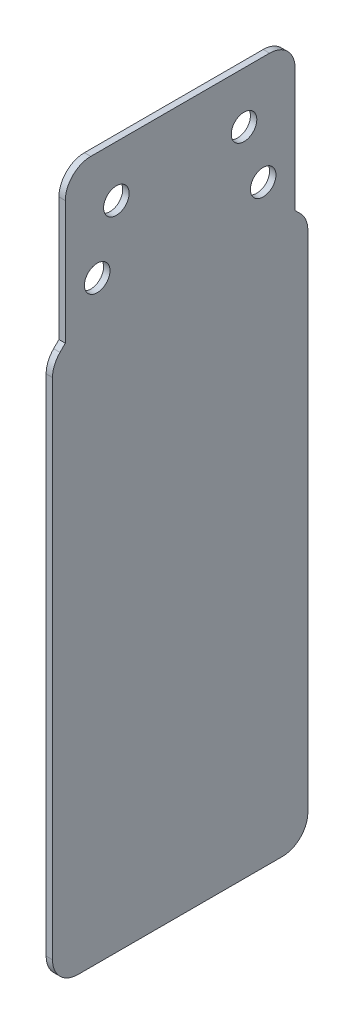
ISO-10303-21;
HEADER;
FILE_DESCRIPTION(('STEP AP214'),'2;1');
FILE_NAME('part.step','',(''),(''),'','','');
FILE_SCHEMA(('AUTOMOTIVE_DESIGN { 1 0 10303 214 1 1 1 1 }'));
ENDSEC;
DATA;
#1=APPLICATION_CONTEXT('core data for automotive mechanical design processes');
#2=APPLICATION_PROTOCOL_DEFINITION('international standard','automotive_design',2000,#1);
#3=PRODUCT_CONTEXT('',#1,'mechanical');
#4=PRODUCT('Part','Part','',(#3));
#5=PRODUCT_RELATED_PRODUCT_CATEGORY('part','',(#4));
#6=PRODUCT_DEFINITION_FORMATION('','',#4);
#7=PRODUCT_DEFINITION_CONTEXT('part definition',#1,'design');
#8=PRODUCT_DEFINITION('design','',#6,#7);
#9=PRODUCT_DEFINITION_SHAPE('','',#8);
#10=(LENGTH_UNIT() NAMED_UNIT(*) SI_UNIT(.MILLI.,.METRE.));
#11=(NAMED_UNIT(*) PLANE_ANGLE_UNIT() SI_UNIT($,.RADIAN.));
#12=(NAMED_UNIT(*) SI_UNIT($,.STERADIAN.) SOLID_ANGLE_UNIT());
#13=UNCERTAINTY_MEASURE_WITH_UNIT(LENGTH_MEASURE(1.E-05),#10,'distance_accuracy_value','');
#14=(GEOMETRIC_REPRESENTATION_CONTEXT(3) GLOBAL_UNCERTAINTY_ASSIGNED_CONTEXT((#13)) GLOBAL_UNIT_ASSIGNED_CONTEXT((#10,
#11,#12)) REPRESENTATION_CONTEXT('',''));
#15=CARTESIAN_POINT('',(0.,0.,0.));
#16=DIRECTION('',(0.,0.,1.));
#17=DIRECTION('',(1.,0.,0.));
#18=AXIS2_PLACEMENT_3D('',#15,#16,#17);
#19=CARTESIAN_POINT('',(1.,0.,-18.));
#20=DIRECTION('',(0.,0.,-1.));
#21=DIRECTION('',(0.,1.,0.));
#22=AXIS2_PLACEMENT_3D('',#19,#20,#21);
#23=PLANE('',#22);
#24=DIRECTION('',(0.,-1.,0.));
#25=VECTOR('',#24,1.);
#26=CARTESIAN_POINT('',(0.,0.,-18.));
#27=LINE('',#26,#25);
#28=CARTESIAN_POINT('',(0.,-3.99999999999999,-18.));
#29=VERTEX_POINT('',#28);
#30=CARTESIAN_POINT('',(0.,-23.35,-18.));
#31=VERTEX_POINT('',#30);
#32=EDGE_CURVE('E240',#29,#31,#27,.T.);
#33=ORIENTED_EDGE('',*,*,#32,.F.);
#34=DIRECTION('',(-1.,0.,0.));
#35=VECTOR('',#34,1.);
#36=CARTESIAN_POINT('',(1.,-3.99999999999999,-18.));
#37=LINE('',#36,#35);
#38=CARTESIAN_POINT('',(1.,-3.99999999999999,-18.));
#39=VERTEX_POINT('',#38);
#40=EDGE_CURVE('E158',#29,#39,#37,.F.);
#41=ORIENTED_EDGE('',*,*,#40,.T.);
#42=DIRECTION('',(0.,-1.,0.));
#43=VECTOR('',#42,1.);
#44=CARTESIAN_POINT('',(1.,0.,-18.));
#45=LINE('',#44,#43);
#46=CARTESIAN_POINT('',(1.00000000000003,-23.35,-18.));
#47=VERTEX_POINT('',#46);
#48=EDGE_CURVE('E144',#39,#47,#45,.T.);
#49=ORIENTED_EDGE('',*,*,#48,.T.);
#50=DIRECTION('',(-1.,0.,0.));
#51=VECTOR('',#50,1.);
#52=CARTESIAN_POINT('',(87.6730782884743,-23.35,-18.));
#53=LINE('',#52,#51);
#54=EDGE_CURVE('E152',#47,#31,#53,.T.);
#55=ORIENTED_EDGE('',*,*,#54,.T.);
#56=EDGE_LOOP('',(#33,#41,#49,#55));
#57=FACE_BOUND('',#56,.T.);
#58=ADVANCED_FACE('F39',(#57),#23,.T.);
#59=CARTESIAN_POINT('',(1.,0.,18.));
#60=DIRECTION('',(0.,0.,-1.));
#61=DIRECTION('',(0.,1.,0.));
#62=AXIS2_PLACEMENT_3D('',#59,#60,#61);
#63=PLANE('',#62);
#64=DIRECTION('',(0.,-1.,0.));
#65=VECTOR('',#64,1.);
#66=CARTESIAN_POINT('',(1.,0.,18.));
#67=LINE('',#66,#65);
#68=CARTESIAN_POINT('',(1.,-4.,18.));
#69=VERTEX_POINT('',#68);
#70=CARTESIAN_POINT('',(1.,-23.35,18.));
#71=VERTEX_POINT('',#70);
#72=EDGE_CURVE('E233',#69,#71,#67,.T.);
#73=ORIENTED_EDGE('',*,*,#72,.F.);
#74=DIRECTION('',(-1.,0.,0.));
#75=VECTOR('',#74,1.);
#76=CARTESIAN_POINT('',(0.,-4.,18.));
#77=LINE('',#76,#75);
#78=CARTESIAN_POINT('',(0.,-4.,18.));
#79=VERTEX_POINT('',#78);
#80=EDGE_CURVE('E236',#69,#79,#77,.T.);
#81=ORIENTED_EDGE('',*,*,#80,.T.);
#82=DIRECTION('',(0.,-1.,0.));
#83=VECTOR('',#82,1.);
#84=CARTESIAN_POINT('',(0.,0.,18.));
#85=LINE('',#84,#83);
#86=CARTESIAN_POINT('',(0.,-23.35,18.));
#87=VERTEX_POINT('',#86);
#88=EDGE_CURVE('E228',#79,#87,#85,.T.);
#89=ORIENTED_EDGE('',*,*,#88,.T.);
#90=DIRECTION('',(-1.,0.,0.));
#91=VECTOR('',#90,1.);
#92=CARTESIAN_POINT('',(87.6730782884743,-23.35,18.));
#93=LINE('',#92,#91);
#94=EDGE_CURVE('E180',#71,#87,#93,.T.);
#95=ORIENTED_EDGE('',*,*,#94,.F.);
#96=EDGE_LOOP('',(#73,#81,#89,#95));
#97=FACE_BOUND('',#96,.T.);
#98=ADVANCED_FACE('F351',(#97),#63,.F.);
#99=CARTESIAN_POINT('',(1.,0.,18.));
#100=DIRECTION('',(0.,1.,0.));
#101=DIRECTION('',(0.,0.,1.));
#102=AXIS2_PLACEMENT_3D('',#99,#100,#101);
#103=PLANE('',#102);
#104=DIRECTION('',(0.,0.,-1.));
#105=VECTOR('',#104,1.);
#106=CARTESIAN_POINT('',(0.,0.,18.));
#107=LINE('',#106,#105);
#108=CARTESIAN_POINT('',(0.,0.,14.));
#109=VERTEX_POINT('',#108);
#110=CARTESIAN_POINT('',(0.,0.,-14.));
#111=VERTEX_POINT('',#110);
#112=EDGE_CURVE('E225',#109,#111,#107,.T.);
#113=ORIENTED_EDGE('',*,*,#112,.F.);
#114=DIRECTION('',(-1.,0.,0.));
#115=VECTOR('',#114,1.);
#116=CARTESIAN_POINT('',(1.,0.,14.));
#117=LINE('',#116,#115);
#118=CARTESIAN_POINT('',(1.,0.,14.));
#119=VERTEX_POINT('',#118);
#120=EDGE_CURVE('E263',#109,#119,#117,.F.);
#121=ORIENTED_EDGE('',*,*,#120,.T.);
#122=DIRECTION('',(0.,0.,-1.));
#123=VECTOR('',#122,1.);
#124=CARTESIAN_POINT('',(1.,0.,18.));
#125=LINE('',#124,#123);
#126=CARTESIAN_POINT('',(1.,0.,-14.));
#127=VERTEX_POINT('',#126);
#128=EDGE_CURVE('E161',#119,#127,#125,.T.);
#129=ORIENTED_EDGE('',*,*,#128,.T.);
#130=DIRECTION('',(-1.,0.,0.));
#131=VECTOR('',#130,1.);
#132=CARTESIAN_POINT('',(1.,0.,-14.));
#133=LINE('',#132,#131);
#134=EDGE_CURVE('E259',#127,#111,#133,.T.);
#135=ORIENTED_EDGE('',*,*,#134,.T.);
#136=EDGE_LOOP('',(#113,#121,#129,#135));
#137=FACE_BOUND('',#136,.T.);
#138=ADVANCED_FACE('F343',(#137),#103,.T.);
#139=CARTESIAN_POINT('',(1.,-110.,18.));
#140=DIRECTION('',(0.,1.,0.));
#141=DIRECTION('',(0.,0.,1.));
#142=AXIS2_PLACEMENT_3D('',#139,#140,#141);
#143=PLANE('',#142);
#144=DIRECTION('',(0.,0.,-1.));
#145=VECTOR('',#144,1.);
#146=CARTESIAN_POINT('',(0.,-110.,18.));
#147=LINE('',#146,#145);
#148=CARTESIAN_POINT('',(0.,-110.,16.));
#149=VERTEX_POINT('',#148);
#150=CARTESIAN_POINT('',(0.,-110.,-16.));
#151=VERTEX_POINT('',#150);
#152=EDGE_CURVE('E243',#149,#151,#147,.T.);
#153=ORIENTED_EDGE('',*,*,#152,.T.);
#154=DIRECTION('',(-1.,0.,0.));
#155=VECTOR('',#154,1.);
#156=CARTESIAN_POINT('',(1.,-110.,-16.));
#157=LINE('',#156,#155);
#158=CARTESIAN_POINT('',(1.,-110.,-16.));
#159=VERTEX_POINT('',#158);
#160=EDGE_CURVE('E11',#151,#159,#157,.F.);
#161=ORIENTED_EDGE('',*,*,#160,.T.);
#162=DIRECTION('',(0.,0.,-1.));
#163=VECTOR('',#162,1.);
#164=CARTESIAN_POINT('',(1.,-110.,18.));
#165=LINE('',#164,#163);
#166=CARTESIAN_POINT('',(1.,-110.,16.));
#167=VERTEX_POINT('',#166);
#168=EDGE_CURVE('E160',#167,#159,#165,.T.);
#169=ORIENTED_EDGE('',*,*,#168,.F.);
#170=DIRECTION('',(-1.,0.,0.));
#171=VECTOR('',#170,1.);
#172=CARTESIAN_POINT('',(0.,-110.,16.));
#173=LINE('',#172,#171);
#174=EDGE_CURVE('E48',#167,#149,#173,.T.);
#175=ORIENTED_EDGE('',*,*,#174,.T.);
#176=EDGE_LOOP('',(#153,#161,#169,#175));
#177=FACE_BOUND('',#176,.T.);
#178=ADVANCED_FACE('F321',(#177),#143,.F.);
#179=CARTESIAN_POINT('',(1.,0.,0.));
#180=DIRECTION('',(-1.,0.,0.));
#181=DIRECTION('',(0.,0.,1.));
#182=AXIS2_PLACEMENT_3D('',#179,#180,#181);
#183=PLANE('',#182);
#184=CARTESIAN_POINT('',(1.,-17.,-13.));
#185=DIRECTION('',(-1.,0.,0.));
#186=DIRECTION('',(0.,0.,1.));
#187=AXIS2_PLACEMENT_3D('',#184,#185,#186);
#188=CIRCLE('',#187,2.);
#189=CARTESIAN_POINT('',(1.,-17.,-11.));
#190=VERTEX_POINT('',#189);
#191=EDGE_CURVE('E197',#190,#190,#188,.T.);
#192=ORIENTED_EDGE('',*,*,#191,.T.);
#193=EDGE_LOOP('',(#192));
#194=FACE_BOUND('',#193,.T.);
#195=CARTESIAN_POINT('',(1.,-17.,13.));
#196=DIRECTION('',(-1.,0.,0.));
#197=DIRECTION('',(0.,0.,1.));
#198=AXIS2_PLACEMENT_3D('',#195,#196,#197);
#199=CIRCLE('',#198,2.);
#200=CARTESIAN_POINT('',(1.,-17.,15.));
#201=VERTEX_POINT('',#200);
#202=EDGE_CURVE('E205',#201,#201,#199,.T.);
#203=ORIENTED_EDGE('',*,*,#202,.T.);
#204=EDGE_LOOP('',(#203));
#205=FACE_BOUND('',#204,.T.);
#206=CARTESIAN_POINT('',(1.,-8.,-9.99999999999999));
#207=DIRECTION('',(-1.,0.,0.));
#208=DIRECTION('',(0.,0.,1.));
#209=AXIS2_PLACEMENT_3D('',#206,#207,#208);
#210=CIRCLE('',#209,2.);
#211=CARTESIAN_POINT('',(1.,-8.,-7.99999999999999));
#212=VERTEX_POINT('',#211);
#213=EDGE_CURVE('E213',#212,#212,#210,.T.);
#214=ORIENTED_EDGE('',*,*,#213,.T.);
#215=EDGE_LOOP('',(#214));
#216=FACE_BOUND('',#215,.T.);
#217=CARTESIAN_POINT('',(1.,-8.,10.));
#218=DIRECTION('',(-1.,0.,0.));
#219=DIRECTION('',(0.,0.,1.));
#220=AXIS2_PLACEMENT_3D('',#217,#218,#219);
#221=CIRCLE('',#220,2.);
#222=CARTESIAN_POINT('',(1.,-8.,12.));
#223=VERTEX_POINT('',#222);
#224=EDGE_CURVE('E221',#223,#223,#221,.T.);
#225=ORIENTED_EDGE('',*,*,#224,.T.);
#226=EDGE_LOOP('',(#225));
#227=FACE_BOUND('',#226,.T.);
#228=DIRECTION('',(0.,-0.707106781186551,0.707106781186544));
#229=VECTOR('',#228,1.);
#230=CARTESIAN_POINT('',(1.,-23.35,18.));
#231=LINE('',#230,#229);
#232=CARTESIAN_POINT('',(1.,-24.1784271247462,18.8284271247462));
#233=VERTEX_POINT('',#232);
#234=EDGE_CURVE('E179',#71,#233,#231,.T.);
#235=ORIENTED_EDGE('',*,*,#234,.T.);
#236=CARTESIAN_POINT('',(1.,-27.0068542494924,16.));
#237=DIRECTION('',(-1.,0.,0.));
#238=DIRECTION('',(0.,0.,1.));
#239=AXIS2_PLACEMENT_3D('',#236,#237,#238);
#240=CIRCLE('',#239,4.);
#241=CARTESIAN_POINT('',(1.,-27.0068542494924,20.));
#242=VERTEX_POINT('',#241);
#243=EDGE_CURVE('E304',#233,#242,#240,.F.);
#244=ORIENTED_EDGE('',*,*,#243,.T.);
#245=DIRECTION('',(0.,-1.,0.));
#246=VECTOR('',#245,1.);
#247=CARTESIAN_POINT('',(1.,-25.35,20.));
#248=LINE('',#247,#246);
#249=CARTESIAN_POINT('',(1.,-106.,20.));
#250=VERTEX_POINT('',#249);
#251=EDGE_CURVE('E175',#242,#250,#248,.T.);
#252=ORIENTED_EDGE('',*,*,#251,.T.);
#253=CARTESIAN_POINT('',(1.,-106.,16.));
#254=DIRECTION('',(-1.,0.,0.));
#255=DIRECTION('',(0.,0.,1.));
#256=AXIS2_PLACEMENT_3D('',#253,#254,#255);
#257=CIRCLE('',#256,4.);
#258=EDGE_CURVE('E296',#250,#167,#257,.F.);
#259=ORIENTED_EDGE('',*,*,#258,.T.);
#260=ORIENTED_EDGE('',*,*,#168,.T.);
#261=CARTESIAN_POINT('',(1.,-106.,-16.));
#262=DIRECTION('',(-1.,0.,0.));
#263=DIRECTION('',(0.,0.,1.));
#264=AXIS2_PLACEMENT_3D('',#261,#262,#263);
#265=CIRCLE('',#264,4.);
#266=CARTESIAN_POINT('',(1.,-106.,-20.));
#267=VERTEX_POINT('',#266);
#268=EDGE_CURVE('E299',#159,#267,#265,.F.);
#269=ORIENTED_EDGE('',*,*,#268,.T.);
#270=DIRECTION('',(0.,1.,0.));
#271=VECTOR('',#270,1.);
#272=CARTESIAN_POINT('',(1.,-25.35,-20.));
#273=LINE('',#272,#271);
#274=CARTESIAN_POINT('',(1.,-27.0068542494924,-20.));
#275=VERTEX_POINT('',#274);
#276=EDGE_CURVE('E151',#267,#275,#273,.T.);
#277=ORIENTED_EDGE('',*,*,#276,.T.);
#278=CARTESIAN_POINT('',(1.,-27.0068542494924,-16.));
#279=DIRECTION('',(-1.,0.,0.));
#280=DIRECTION('',(0.,0.,1.));
#281=AXIS2_PLACEMENT_3D('',#278,#279,#280);
#282=CIRCLE('',#281,4.);
#283=CARTESIAN_POINT('',(1.,-24.1784271247462,-18.8284271247462));
#284=VERTEX_POINT('',#283);
#285=EDGE_CURVE('E55',#275,#284,#282,.F.);
#286=ORIENTED_EDGE('',*,*,#285,.T.);
#287=DIRECTION('',(0.,0.707106781186551,0.707106781186544));
#288=VECTOR('',#287,1.);
#289=CARTESIAN_POINT('',(1.,-23.35,-18.));
#290=LINE('',#289,#288);
#291=EDGE_CURVE('E140',#284,#47,#290,.T.);
#292=ORIENTED_EDGE('',*,*,#291,.T.);
#293=ORIENTED_EDGE('',*,*,#48,.F.);
#294=CARTESIAN_POINT('',(1.,-3.99999999999999,-14.));
#295=DIRECTION('',(-1.,0.,0.));
#296=DIRECTION('',(0.,0.,1.));
#297=AXIS2_PLACEMENT_3D('',#294,#295,#296);
#298=CIRCLE('',#297,4.);
#299=EDGE_CURVE('E266',#39,#127,#298,.F.);
#300=ORIENTED_EDGE('',*,*,#299,.T.);
#301=ORIENTED_EDGE('',*,*,#128,.F.);
#302=CARTESIAN_POINT('',(1.,-4.,14.));
#303=DIRECTION('',(-1.,0.,0.));
#304=DIRECTION('',(0.,0.,1.));
#305=AXIS2_PLACEMENT_3D('',#302,#303,#304);
#306=CIRCLE('',#305,4.);
#307=EDGE_CURVE('E269',#119,#69,#306,.F.);
#308=ORIENTED_EDGE('',*,*,#307,.T.);
#309=ORIENTED_EDGE('',*,*,#72,.T.);
#310=EDGE_LOOP('',(#235,#244,#252,#259,#260,#269,#277,#286,#292,#293,#300,#301,#308,#309));
#311=FACE_BOUND('',#310,.T.);
#312=ADVANCED_FACE('F143',(#194,#205,#216,#227,#311),#183,.F.);
#313=CARTESIAN_POINT('',(0.,0.,0.));
#314=DIRECTION('',(-1.,0.,0.));
#315=DIRECTION('',(0.,0.,1.));
#316=AXIS2_PLACEMENT_3D('',#313,#314,#315);
#317=PLANE('',#316);
#318=CARTESIAN_POINT('',(0.,-17.,-13.));
#319=DIRECTION('',(-1.,0.,0.));
#320=DIRECTION('',(0.,0.,1.));
#321=AXIS2_PLACEMENT_3D('',#318,#319,#320);
#322=CIRCLE('',#321,2.);
#323=CARTESIAN_POINT('',(0.,-17.,-11.));
#324=VERTEX_POINT('',#323);
#325=EDGE_CURVE('E183',#324,#324,#322,.T.);
#326=ORIENTED_EDGE('',*,*,#325,.F.);
#327=EDGE_LOOP('',(#326));
#328=FACE_BOUND('',#327,.T.);
#329=CARTESIAN_POINT('',(0.,-17.,13.));
#330=DIRECTION('',(-1.,0.,0.));
#331=DIRECTION('',(0.,0.,1.));
#332=AXIS2_PLACEMENT_3D('',#329,#330,#331);
#333=CIRCLE('',#332,2.);
#334=CARTESIAN_POINT('',(0.,-17.,15.));
#335=VERTEX_POINT('',#334);
#336=EDGE_CURVE('E201',#335,#335,#333,.T.);
#337=ORIENTED_EDGE('',*,*,#336,.F.);
#338=EDGE_LOOP('',(#337));
#339=FACE_BOUND('',#338,.T.);
#340=CARTESIAN_POINT('',(0.,-8.,-9.99999999999999));
#341=DIRECTION('',(-1.,0.,0.));
#342=DIRECTION('',(0.,0.,1.));
#343=AXIS2_PLACEMENT_3D('',#340,#341,#342);
#344=CIRCLE('',#343,2.);
#345=CARTESIAN_POINT('',(0.,-8.,-7.99999999999999));
#346=VERTEX_POINT('',#345);
#347=EDGE_CURVE('E209',#346,#346,#344,.T.);
#348=ORIENTED_EDGE('',*,*,#347,.F.);
#349=EDGE_LOOP('',(#348));
#350=FACE_BOUND('',#349,.T.);
#351=CARTESIAN_POINT('',(0.,-8.,10.));
#352=DIRECTION('',(-1.,0.,0.));
#353=DIRECTION('',(0.,0.,1.));
#354=AXIS2_PLACEMENT_3D('',#351,#352,#353);
#355=CIRCLE('',#354,2.);
#356=CARTESIAN_POINT('',(0.,-8.,12.));
#357=VERTEX_POINT('',#356);
#358=EDGE_CURVE('E217',#357,#357,#355,.T.);
#359=ORIENTED_EDGE('',*,*,#358,.F.);
#360=EDGE_LOOP('',(#359));
#361=FACE_BOUND('',#360,.T.);
#362=DIRECTION('',(0.,1.,0.));
#363=VECTOR('',#362,1.);
#364=CARTESIAN_POINT('',(0.,-25.35,20.));
#365=LINE('',#364,#363);
#366=CARTESIAN_POINT('',(0.,-106.,20.));
#367=VERTEX_POINT('',#366);
#368=CARTESIAN_POINT('',(0.,-27.0068542494924,20.));
#369=VERTEX_POINT('',#368);
#370=EDGE_CURVE('E184',#367,#369,#365,.T.);
#371=ORIENTED_EDGE('',*,*,#370,.T.);
#372=CARTESIAN_POINT('',(0.,-27.0068542494924,16.));
#373=DIRECTION('',(-1.,0.,0.));
#374=DIRECTION('',(0.,0.,1.));
#375=AXIS2_PLACEMENT_3D('',#372,#373,#374);
#376=CIRCLE('',#375,4.);
#377=CARTESIAN_POINT('',(0.,-24.1784271247462,18.8284271247462));
#378=VERTEX_POINT('',#377);
#379=EDGE_CURVE('E290',#369,#378,#376,.T.);
#380=ORIENTED_EDGE('',*,*,#379,.T.);
#381=DIRECTION('',(0.,0.707106781186551,-0.707106781186544));
#382=VECTOR('',#381,1.);
#383=CARTESIAN_POINT('',(0.,-23.35,18.));
#384=LINE('',#383,#382);
#385=EDGE_CURVE('E188',#378,#87,#384,.T.);
#386=ORIENTED_EDGE('',*,*,#385,.T.);
#387=ORIENTED_EDGE('',*,*,#88,.F.);
#388=CARTESIAN_POINT('',(0.,-4.,14.));
#389=DIRECTION('',(-1.,0.,0.));
#390=DIRECTION('',(0.,0.,1.));
#391=AXIS2_PLACEMENT_3D('',#388,#389,#390);
#392=CIRCLE('',#391,4.);
#393=EDGE_CURVE('E256',#79,#109,#392,.T.);
#394=ORIENTED_EDGE('',*,*,#393,.T.);
#395=ORIENTED_EDGE('',*,*,#112,.T.);
#396=CARTESIAN_POINT('',(0.,-3.99999999999999,-14.));
#397=DIRECTION('',(-1.,0.,0.));
#398=DIRECTION('',(0.,0.,1.));
#399=AXIS2_PLACEMENT_3D('',#396,#397,#398);
#400=CIRCLE('',#399,4.);
#401=EDGE_CURVE('E253',#111,#29,#400,.T.);
#402=ORIENTED_EDGE('',*,*,#401,.T.);
#403=ORIENTED_EDGE('',*,*,#32,.T.);
#404=DIRECTION('',(0.,-0.707106781186551,-0.707106781186544));
#405=VECTOR('',#404,1.);
#406=CARTESIAN_POINT('',(0.,-23.35,-18.));
#407=LINE('',#406,#405);
#408=CARTESIAN_POINT('',(0.,-24.1784271247462,-18.8284271247462));
#409=VERTEX_POINT('',#408);
#410=EDGE_CURVE('E166',#31,#409,#407,.T.);
#411=ORIENTED_EDGE('',*,*,#410,.T.);
#412=CARTESIAN_POINT('',(0.,-27.0068542494924,-16.));
#413=DIRECTION('',(-1.,0.,0.));
#414=DIRECTION('',(0.,0.,1.));
#415=AXIS2_PLACEMENT_3D('',#412,#413,#414);
#416=CIRCLE('',#415,4.);
#417=CARTESIAN_POINT('',(0.,-27.0068542494924,-20.));
#418=VERTEX_POINT('',#417);
#419=EDGE_CURVE('E287',#409,#418,#416,.T.);
#420=ORIENTED_EDGE('',*,*,#419,.T.);
#421=DIRECTION('',(0.,-1.,0.));
#422=VECTOR('',#421,1.);
#423=CARTESIAN_POINT('',(0.,-25.35,-20.));
#424=LINE('',#423,#422);
#425=CARTESIAN_POINT('',(0.,-106.,-20.));
#426=VERTEX_POINT('',#425);
#427=EDGE_CURVE('E168',#418,#426,#424,.T.);
#428=ORIENTED_EDGE('',*,*,#427,.T.);
#429=CARTESIAN_POINT('',(0.,-106.,-16.));
#430=DIRECTION('',(-1.,0.,0.));
#431=DIRECTION('',(0.,0.,1.));
#432=AXIS2_PLACEMENT_3D('',#429,#430,#431);
#433=CIRCLE('',#432,4.);
#434=EDGE_CURVE('E284',#426,#151,#433,.T.);
#435=ORIENTED_EDGE('',*,*,#434,.T.);
#436=ORIENTED_EDGE('',*,*,#152,.F.);
#437=CARTESIAN_POINT('',(0.,-106.,16.));
#438=DIRECTION('',(-1.,0.,0.));
#439=DIRECTION('',(0.,0.,1.));
#440=AXIS2_PLACEMENT_3D('',#437,#438,#439);
#441=CIRCLE('',#440,4.);
#442=EDGE_CURVE('E281',#149,#367,#441,.T.);
#443=ORIENTED_EDGE('',*,*,#442,.T.);
#444=EDGE_LOOP('',(#371,#380,#386,#387,#394,#395,#402,#403,#411,#420,#428,#435,#436,#443));
#445=FACE_BOUND('',#444,.T.);
#446=ADVANCED_FACE('F326',(#328,#339,#350,#361,#445),#317,.T.);
#447=CARTESIAN_POINT('',(0.,-8.,10.));
#448=DIRECTION('',(-1.,0.,0.));
#449=DIRECTION('',(0.,0.,1.));
#450=AXIS2_PLACEMENT_3D('',#447,#448,#449);
#451=CYLINDRICAL_SURFACE('',#450,2.);
#452=ORIENTED_EDGE('',*,*,#224,.F.);
#453=EDGE_LOOP('',(#452));
#454=FACE_BOUND('',#453,.T.);
#455=ORIENTED_EDGE('',*,*,#358,.T.);
#456=EDGE_LOOP('',(#455));
#457=FACE_BOUND('',#456,.T.);
#458=ADVANCED_FACE('F458',(#454,#457),#451,.F.);
#459=CARTESIAN_POINT('',(0.,-8.,-9.99999999999999));
#460=DIRECTION('',(-1.,0.,0.));
#461=DIRECTION('',(0.,0.,1.));
#462=AXIS2_PLACEMENT_3D('',#459,#460,#461);
#463=CYLINDRICAL_SURFACE('',#462,2.);
#464=ORIENTED_EDGE('',*,*,#213,.F.);
#465=EDGE_LOOP('',(#464));
#466=FACE_BOUND('',#465,.T.);
#467=ORIENTED_EDGE('',*,*,#347,.T.);
#468=EDGE_LOOP('',(#467));
#469=FACE_BOUND('',#468,.T.);
#470=ADVANCED_FACE('F512',(#466,#469),#463,.F.);
#471=CARTESIAN_POINT('',(0.,-17.,13.));
#472=DIRECTION('',(-1.,0.,0.));
#473=DIRECTION('',(0.,0.,1.));
#474=AXIS2_PLACEMENT_3D('',#471,#472,#473);
#475=CYLINDRICAL_SURFACE('',#474,2.);
#476=ORIENTED_EDGE('',*,*,#202,.F.);
#477=EDGE_LOOP('',(#476));
#478=FACE_BOUND('',#477,.T.);
#479=ORIENTED_EDGE('',*,*,#336,.T.);
#480=EDGE_LOOP('',(#479));
#481=FACE_BOUND('',#480,.T.);
#482=ADVANCED_FACE('F502',(#478,#481),#475,.F.);
#483=CARTESIAN_POINT('',(0.,-17.,-13.));
#484=DIRECTION('',(-1.,0.,0.));
#485=DIRECTION('',(0.,0.,1.));
#486=AXIS2_PLACEMENT_3D('',#483,#484,#485);
#487=CYLINDRICAL_SURFACE('',#486,2.);
#488=ORIENTED_EDGE('',*,*,#191,.F.);
#489=EDGE_LOOP('',(#488));
#490=FACE_BOUND('',#489,.T.);
#491=ORIENTED_EDGE('',*,*,#325,.T.);
#492=EDGE_LOOP('',(#491));
#493=FACE_BOUND('',#492,.T.);
#494=ADVANCED_FACE('F450',(#490,#493),#487,.F.);
#495=CARTESIAN_POINT('',(87.6730782884743,-23.35,18.));
#496=DIRECTION('',(0.,0.707106781186544,0.707106781186551));
#497=DIRECTION('',(0.,-0.707106781186551,0.707106781186544));
#498=AXIS2_PLACEMENT_3D('',#495,#496,#497);
#499=PLANE('',#498);
#500=ORIENTED_EDGE('',*,*,#385,.F.);
#501=DIRECTION('',(-1.,0.,0.));
#502=VECTOR('',#501,1.);
#503=CARTESIAN_POINT('',(87.6730782884743,-24.1784271247462,18.8284271247462));
#504=LINE('',#503,#502);
#505=EDGE_CURVE('E293',#378,#233,#504,.F.);
#506=ORIENTED_EDGE('',*,*,#505,.T.);
#507=ORIENTED_EDGE('',*,*,#234,.F.);
#508=ORIENTED_EDGE('',*,*,#94,.T.);
#509=EDGE_LOOP('',(#500,#506,#507,#508));
#510=FACE_BOUND('',#509,.T.);
#511=ADVANCED_FACE('F356',(#510),#499,.T.);
#512=CARTESIAN_POINT('',(87.6730782884743,-25.35,20.));
#513=DIRECTION('',(0.,0.,1.));
#514=DIRECTION('',(0.,-1.,0.));
#515=AXIS2_PLACEMENT_3D('',#512,#513,#514);
#516=PLANE('',#515);
#517=ORIENTED_EDGE('',*,*,#251,.F.);
#518=DIRECTION('',(-1.,0.,0.));
#519=VECTOR('',#518,1.);
#520=CARTESIAN_POINT('',(87.6730782884743,-27.0068542494924,20.));
#521=LINE('',#520,#519);
#522=EDGE_CURVE('E277',#242,#369,#521,.T.);
#523=ORIENTED_EDGE('',*,*,#522,.T.);
#524=ORIENTED_EDGE('',*,*,#370,.F.);
#525=DIRECTION('',(-1.,0.,0.));
#526=VECTOR('',#525,1.);
#527=CARTESIAN_POINT('',(1.00000000000003,-106.,20.));
#528=LINE('',#527,#526);
#529=EDGE_CURVE('E274',#367,#250,#528,.F.);
#530=ORIENTED_EDGE('',*,*,#529,.T.);
#531=EDGE_LOOP('',(#517,#523,#524,#530));
#532=FACE_BOUND('',#531,.T.);
#533=ADVANCED_FACE('F364',(#532),#516,.T.);
#534=CARTESIAN_POINT('',(87.6730782884743,-25.35,-20.));
#535=DIRECTION('',(0.,0.,-1.));
#536=DIRECTION('',(0.,1.,0.));
#537=AXIS2_PLACEMENT_3D('',#534,#535,#536);
#538=PLANE('',#537);
#539=ORIENTED_EDGE('',*,*,#427,.F.);
#540=DIRECTION('',(-1.,0.,0.));
#541=VECTOR('',#540,1.);
#542=CARTESIAN_POINT('',(87.6730782884743,-27.0068542494924,-20.));
#543=LINE('',#542,#541);
#544=EDGE_CURVE('E63',#418,#275,#543,.F.);
#545=ORIENTED_EDGE('',*,*,#544,.T.);
#546=ORIENTED_EDGE('',*,*,#276,.F.);
#547=DIRECTION('',(-1.,0.,0.));
#548=VECTOR('',#547,1.);
#549=CARTESIAN_POINT('',(0.,-106.,-20.));
#550=LINE('',#549,#548);
#551=EDGE_CURVE('E310',#267,#426,#550,.T.);
#552=ORIENTED_EDGE('',*,*,#551,.T.);
#553=EDGE_LOOP('',(#539,#545,#546,#552));
#554=FACE_BOUND('',#553,.T.);
#555=ADVANCED_FACE('F332',(#554),#538,.T.);
#556=CARTESIAN_POINT('',(87.6730782884743,-23.35,-18.));
#557=DIRECTION('',(0.,0.707106781186544,-0.707106781186551));
#558=DIRECTION('',(0.,0.707106781186551,0.707106781186544));
#559=AXIS2_PLACEMENT_3D('',#556,#557,#558);
#560=PLANE('',#559);
#561=ORIENTED_EDGE('',*,*,#291,.F.);
#562=DIRECTION('',(-1.,0.,0.));
#563=VECTOR('',#562,1.);
#564=CARTESIAN_POINT('',(87.6730782884743,-24.1784271247462,-18.8284271247462));
#565=LINE('',#564,#563);
#566=EDGE_CURVE('E307',#284,#409,#565,.T.);
#567=ORIENTED_EDGE('',*,*,#566,.T.);
#568=ORIENTED_EDGE('',*,*,#410,.F.);
#569=ORIENTED_EDGE('',*,*,#54,.F.);
#570=EDGE_LOOP('',(#561,#567,#568,#569));
#571=FACE_BOUND('',#570,.T.);
#572=ADVANCED_FACE('F164',(#571),#560,.T.);
#573=CARTESIAN_POINT('',(1.,-4.,14.));
#574=DIRECTION('',(1.,0.,0.));
#575=DIRECTION('',(0.,0.,-1.));
#576=AXIS2_PLACEMENT_3D('',#573,#574,#575);
#577=CYLINDRICAL_SURFACE('',#576,4.);
#578=ORIENTED_EDGE('',*,*,#307,.F.);
#579=ORIENTED_EDGE('',*,*,#120,.F.);
#580=ORIENTED_EDGE('',*,*,#393,.F.);
#581=ORIENTED_EDGE('',*,*,#80,.F.);
#582=EDGE_LOOP('',(#578,#579,#580,#581));
#583=FACE_BOUND('',#582,.T.);
#584=ADVANCED_FACE('F346',(#583),#577,.T.);
#585=CARTESIAN_POINT('',(1.,-3.99999999999999,-14.));
#586=DIRECTION('',(-1.,0.,0.));
#587=DIRECTION('',(0.,0.,1.));
#588=AXIS2_PLACEMENT_3D('',#585,#586,#587);
#589=CYLINDRICAL_SURFACE('',#588,4.);
#590=ORIENTED_EDGE('',*,*,#299,.F.);
#591=ORIENTED_EDGE('',*,*,#40,.F.);
#592=ORIENTED_EDGE('',*,*,#401,.F.);
#593=ORIENTED_EDGE('',*,*,#134,.F.);
#594=EDGE_LOOP('',(#590,#591,#592,#593));
#595=FACE_BOUND('',#594,.T.);
#596=ADVANCED_FACE('F337',(#595),#589,.T.);
#597=CARTESIAN_POINT('',(87.6730782884743,-27.0068542494924,16.));
#598=DIRECTION('',(-1.,0.,0.));
#599=DIRECTION('',(0.,0.,1.));
#600=AXIS2_PLACEMENT_3D('',#597,#598,#599);
#601=CYLINDRICAL_SURFACE('',#600,4.);
#602=ORIENTED_EDGE('',*,*,#243,.F.);
#603=ORIENTED_EDGE('',*,*,#505,.F.);
#604=ORIENTED_EDGE('',*,*,#379,.F.);
#605=ORIENTED_EDGE('',*,*,#522,.F.);
#606=EDGE_LOOP('',(#602,#603,#604,#605));
#607=FACE_BOUND('',#606,.T.);
#608=ADVANCED_FACE('F362',(#607),#601,.T.);
#609=CARTESIAN_POINT('',(87.6730782884743,-27.0068542494924,-16.));
#610=DIRECTION('',(-1.,0.,0.));
#611=DIRECTION('',(0.,0.,1.));
#612=AXIS2_PLACEMENT_3D('',#609,#610,#611);
#613=CYLINDRICAL_SURFACE('',#612,4.);
#614=ORIENTED_EDGE('',*,*,#285,.F.);
#615=ORIENTED_EDGE('',*,*,#544,.F.);
#616=ORIENTED_EDGE('',*,*,#419,.F.);
#617=ORIENTED_EDGE('',*,*,#566,.F.);
#618=EDGE_LOOP('',(#614,#615,#616,#617));
#619=FACE_BOUND('',#618,.T.);
#620=ADVANCED_FACE('F370',(#619),#613,.T.);
#621=CARTESIAN_POINT('',(87.6730782884743,-106.,-16.));
#622=DIRECTION('',(1.,0.,0.));
#623=DIRECTION('',(0.,0.,-1.));
#624=AXIS2_PLACEMENT_3D('',#621,#622,#623);
#625=CYLINDRICAL_SURFACE('',#624,4.);
#626=ORIENTED_EDGE('',*,*,#268,.F.);
#627=ORIENTED_EDGE('',*,*,#160,.F.);
#628=ORIENTED_EDGE('',*,*,#434,.F.);
#629=ORIENTED_EDGE('',*,*,#551,.F.);
#630=EDGE_LOOP('',(#626,#627,#628,#629));
#631=FACE_BOUND('',#630,.T.);
#632=ADVANCED_FACE('F331',(#631),#625,.T.);
#633=CARTESIAN_POINT('',(1.,-106.,16.));
#634=DIRECTION('',(1.,0.,0.));
#635=DIRECTION('',(0.,0.,-1.));
#636=AXIS2_PLACEMENT_3D('',#633,#634,#635);
#637=CYLINDRICAL_SURFACE('',#636,4.);
#638=ORIENTED_EDGE('',*,*,#258,.F.);
#639=ORIENTED_EDGE('',*,*,#529,.F.);
#640=ORIENTED_EDGE('',*,*,#442,.F.);
#641=ORIENTED_EDGE('',*,*,#174,.F.);
#642=EDGE_LOOP('',(#638,#639,#640,#641));
#643=FACE_BOUND('',#642,.T.);
#644=ADVANCED_FACE('F41',(#643),#637,.T.);
#645=CLOSED_SHELL('',(#58,#98,#138,#178,#312,#446,#458,#470,#482,#494,#511,#533,#555,#572,#584,
#596,#608,#620,#632,#644));
#646=MANIFOLD_SOLID_BREP('B2',#645);
#647=ADVANCED_BREP_SHAPE_REPRESENTATION('',(#18,#646),#14);
#648=SHAPE_DEFINITION_REPRESENTATION(#9,#647);
ENDSEC;
END-ISO-10303-21;
